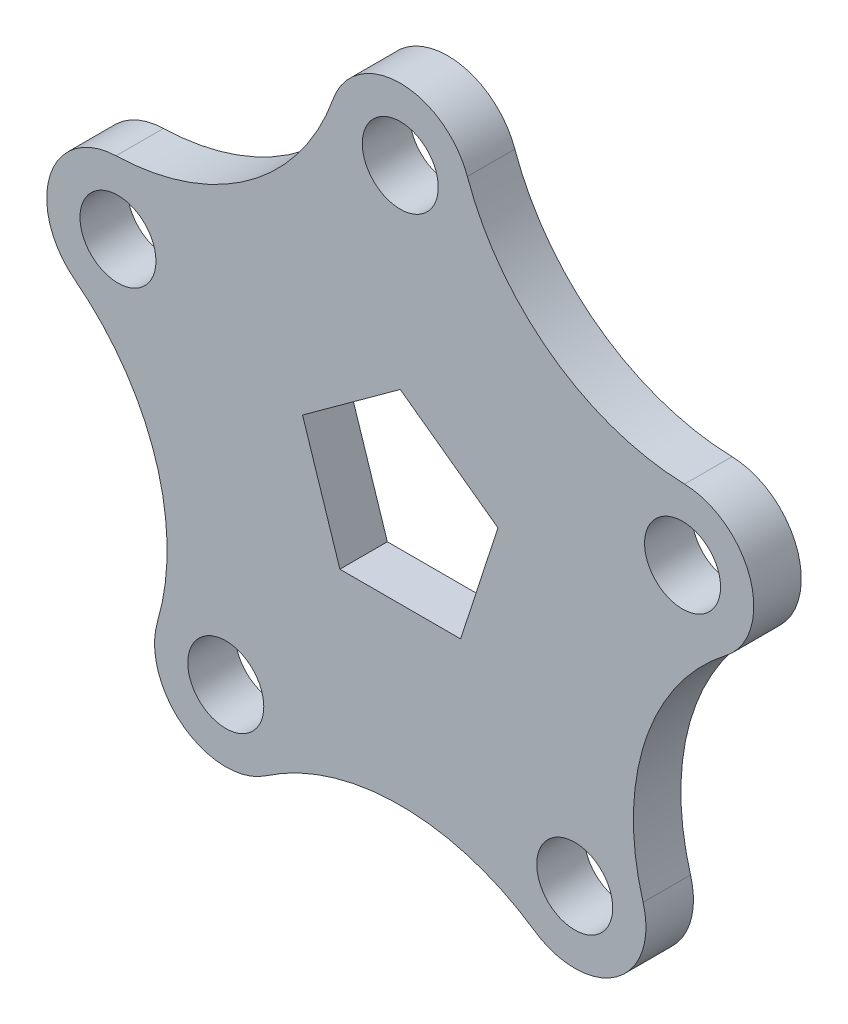
ISO-10303-21;
HEADER;
FILE_DESCRIPTION(('STEP AP214'),'2;1');
FILE_NAME('part.step','',(''),(''),'','','');
FILE_SCHEMA(('AUTOMOTIVE_DESIGN { 1 0 10303 214 1 1 1 1 }'));
ENDSEC;
DATA;
#1=APPLICATION_CONTEXT('core data for automotive mechanical design processes');
#2=APPLICATION_PROTOCOL_DEFINITION('international standard','automotive_design',2000,#1);
#3=PRODUCT_CONTEXT('',#1,'mechanical');
#4=PRODUCT('Part','Part','',(#3));
#5=PRODUCT_RELATED_PRODUCT_CATEGORY('part','',(#4));
#6=PRODUCT_DEFINITION_FORMATION('','',#4);
#7=PRODUCT_DEFINITION_CONTEXT('part definition',#1,'design');
#8=PRODUCT_DEFINITION('design','',#6,#7);
#9=PRODUCT_DEFINITION_SHAPE('','',#8);
#10=(LENGTH_UNIT() NAMED_UNIT(*) SI_UNIT(.MILLI.,.METRE.));
#11=(NAMED_UNIT(*) PLANE_ANGLE_UNIT() SI_UNIT($,.RADIAN.));
#12=(NAMED_UNIT(*) SI_UNIT($,.STERADIAN.) SOLID_ANGLE_UNIT());
#13=UNCERTAINTY_MEASURE_WITH_UNIT(LENGTH_MEASURE(1.E-05),#10,'distance_accuracy_value','');
#14=(GEOMETRIC_REPRESENTATION_CONTEXT(3) GLOBAL_UNCERTAINTY_ASSIGNED_CONTEXT((#13)) GLOBAL_UNIT_ASSIGNED_CONTEXT((#10,
#11,#12)) REPRESENTATION_CONTEXT('',''));
#15=CARTESIAN_POINT('',(0.,0.,0.));
#16=DIRECTION('',(0.,0.,1.));
#17=DIRECTION('',(1.,0.,0.));
#18=AXIS2_PLACEMENT_3D('',#15,#16,#17);
#19=CARTESIAN_POINT('',(-16.6434890351652,-5.40779740156157,10.));
#20=DIRECTION('',(-0.951056516295154,-0.309016994374947,0.));
#21=DIRECTION('',(0.309016994374947,-0.951056516295154,0.));
#22=AXIS2_PLACEMENT_3D('',#19,#20,#21);
#23=PLANE('',#22);
#24=DIRECTION('',(-0.309016994374947,0.951056516295154,0.));
#25=VECTOR('',#24,1.);
#26=CARTESIAN_POINT('',(-16.6434890351652,-5.40779740156157,0.));
#27=LINE('',#26,#25);
#28=CARTESIAN_POINT('',(-12.7144942400938,-17.5,0.));
#29=VERTEX_POINT('',#28);
#30=CARTESIAN_POINT('',(-20.5724838302365,6.68440519687684,0.));
#31=VERTEX_POINT('',#30);
#32=EDGE_CURVE('E250',#29,#31,#27,.T.);
#33=ORIENTED_EDGE('',*,*,#32,.T.);
#34=DIRECTION('',(0.,0.,-1.));
#35=VECTOR('',#34,1.);
#36=CARTESIAN_POINT('',(-20.5724838302365,6.68440519687684,10.));
#37=LINE('',#36,#35);
#38=CARTESIAN_POINT('',(-20.5724838302365,6.68440519687684,10.));
#39=VERTEX_POINT('',#38);
#40=EDGE_CURVE('E11',#39,#31,#37,.T.);
#41=ORIENTED_EDGE('',*,*,#40,.F.);
#42=DIRECTION('',(-0.309016994374947,0.951056516295154,0.));
#43=VECTOR('',#42,1.);
#44=CARTESIAN_POINT('',(-16.6434890351652,-5.40779740156157,10.));
#45=LINE('',#44,#43);
#46=CARTESIAN_POINT('',(-12.7144942400938,-17.5,10.));
#47=VERTEX_POINT('',#46);
#48=EDGE_CURVE('E351',#47,#39,#45,.T.);
#49=ORIENTED_EDGE('',*,*,#48,.F.);
#50=DIRECTION('',(0.,0.,-1.));
#51=VECTOR('',#50,1.);
#52=CARTESIAN_POINT('',(-12.7144942400938,-17.5,10.));
#53=LINE('',#52,#51);
#54=EDGE_CURVE('E264',#47,#29,#53,.T.);
#55=ORIENTED_EDGE('',*,*,#54,.T.);
#56=EDGE_LOOP('',(#33,#41,#49,#55));
#57=FACE_BOUND('',#56,.T.);
#58=ADVANCED_FACE('F45',(#57),#23,.F.);
#59=CARTESIAN_POINT('',(-10.2862419151183,14.1577974015616,10.));
#60=DIRECTION('',(-0.587785252292474,0.809016994374947,0.));
#61=DIRECTION('',(-0.809016994374947,-0.587785252292474,0.));
#62=AXIS2_PLACEMENT_3D('',#59,#60,#61);
#63=PLANE('',#62);
#64=DIRECTION('',(0.809016994374947,0.587785252292474,0.));
#65=VECTOR('',#64,1.);
#66=CARTESIAN_POINT('',(-10.2862419151183,14.1577974015616,0.));
#67=LINE('',#66,#65);
#68=CARTESIAN_POINT('',(0.,21.6311896062463,0.));
#69=VERTEX_POINT('',#68);
#70=EDGE_CURVE('E254',#31,#69,#67,.T.);
#71=ORIENTED_EDGE('',*,*,#70,.T.);
#72=DIRECTION('',(0.,0.,-1.));
#73=VECTOR('',#72,1.);
#74=CARTESIAN_POINT('',(0.,21.6311896062463,10.));
#75=LINE('',#74,#73);
#76=CARTESIAN_POINT('',(0.,21.6311896062463,10.));
#77=VERTEX_POINT('',#76);
#78=EDGE_CURVE('E56',#77,#69,#75,.T.);
#79=ORIENTED_EDGE('',*,*,#78,.F.);
#80=DIRECTION('',(0.809016994374947,0.587785252292474,0.));
#81=VECTOR('',#80,1.);
#82=CARTESIAN_POINT('',(-10.2862419151183,14.1577974015616,10.));
#83=LINE('',#82,#81);
#84=EDGE_CURVE('E169',#39,#77,#83,.T.);
#85=ORIENTED_EDGE('',*,*,#84,.F.);
#86=ORIENTED_EDGE('',*,*,#40,.T.);
#87=EDGE_LOOP('',(#71,#79,#85,#86));
#88=FACE_BOUND('',#87,.T.);
#89=ADVANCED_FACE('F359',(#88),#63,.F.);
#90=CARTESIAN_POINT('',(10.2862419151183,14.1577974015616,10.));
#91=DIRECTION('',(0.587785252292473,0.809016994374947,0.));
#92=DIRECTION('',(-0.809016994374948,0.587785252292473,0.));
#93=AXIS2_PLACEMENT_3D('',#90,#91,#92);
#94=PLANE('',#93);
#95=DIRECTION('',(0.809016994374947,-0.587785252292473,0.));
#96=VECTOR('',#95,1.);
#97=CARTESIAN_POINT('',(10.2862419151183,14.1577974015616,0.));
#98=LINE('',#97,#96);
#99=CARTESIAN_POINT('',(20.5724838302366,6.68440519687684,0.));
#100=VERTEX_POINT('',#99);
#101=EDGE_CURVE('E178',#69,#100,#98,.T.);
#102=ORIENTED_EDGE('',*,*,#101,.T.);
#103=DIRECTION('',(0.,0.,-1.));
#104=VECTOR('',#103,1.);
#105=CARTESIAN_POINT('',(20.5724838302366,6.68440519687684,10.));
#106=LINE('',#105,#104);
#107=CARTESIAN_POINT('',(20.5724838302366,6.68440519687684,10.));
#108=VERTEX_POINT('',#107);
#109=EDGE_CURVE('E175',#108,#100,#106,.T.);
#110=ORIENTED_EDGE('',*,*,#109,.F.);
#111=DIRECTION('',(0.809016994374947,-0.587785252292473,0.));
#112=VECTOR('',#111,1.);
#113=CARTESIAN_POINT('',(10.2862419151183,14.1577974015616,10.));
#114=LINE('',#113,#112);
#115=EDGE_CURVE('E164',#77,#108,#114,.T.);
#116=ORIENTED_EDGE('',*,*,#115,.F.);
#117=ORIENTED_EDGE('',*,*,#78,.T.);
#118=EDGE_LOOP('',(#102,#110,#116,#117));
#119=FACE_BOUND('',#118,.T.);
#120=ADVANCED_FACE('F176',(#119),#94,.F.);
#121=CARTESIAN_POINT('',(16.6434890351652,-5.40779740156158,10.));
#122=DIRECTION('',(0.951056516295154,-0.309016994374948,0.));
#123=DIRECTION('',(0.309016994374948,0.951056516295154,0.));
#124=AXIS2_PLACEMENT_3D('',#121,#122,#123);
#125=PLANE('',#124);
#126=DIRECTION('',(-0.309016994374948,-0.951056516295154,0.));
#127=VECTOR('',#126,1.);
#128=CARTESIAN_POINT('',(16.6434890351652,-5.40779740156158,0.));
#129=LINE('',#128,#127);
#130=CARTESIAN_POINT('',(12.7144942400938,-17.5,0.));
#131=VERTEX_POINT('',#130);
#132=EDGE_CURVE('E115',#100,#131,#129,.T.);
#133=ORIENTED_EDGE('',*,*,#132,.T.);
#134=DIRECTION('',(0.,0.,-1.));
#135=VECTOR('',#134,1.);
#136=CARTESIAN_POINT('',(12.7144942400938,-17.5,10.));
#137=LINE('',#136,#135);
#138=CARTESIAN_POINT('',(12.7144942400938,-17.5,10.));
#139=VERTEX_POINT('',#138);
#140=EDGE_CURVE('E180',#139,#131,#137,.T.);
#141=ORIENTED_EDGE('',*,*,#140,.F.);
#142=DIRECTION('',(-0.309016994374948,-0.951056516295154,0.));
#143=VECTOR('',#142,1.);
#144=CARTESIAN_POINT('',(16.6434890351652,-5.40779740156158,10.));
#145=LINE('',#144,#143);
#146=EDGE_CURVE('E168',#108,#139,#145,.T.);
#147=ORIENTED_EDGE('',*,*,#146,.F.);
#148=ORIENTED_EDGE('',*,*,#109,.T.);
#149=EDGE_LOOP('',(#133,#141,#147,#148));
#150=FACE_BOUND('',#149,.T.);
#151=ADVANCED_FACE('F182',(#150),#125,.F.);
#152=CARTESIAN_POINT('',(-61.2393120472361,84.2886819239083,10.));
#153=DIRECTION('',(0.,0.,-1.));
#154=DIRECTION('',(-1.,0.,0.));
#155=AXIS2_PLACEMENT_3D('',#152,#153,#154);
#156=CYLINDRICAL_SURFACE('',#155,50.);
#157=CARTESIAN_POINT('',(-61.2393120472361,84.2886819239083,0.));
#158=DIRECTION('',(0.,0.,1.));
#159=DIRECTION('',(1.,0.,0.));
#160=AXIS2_PLACEMENT_3D('',#157,#158,#159);
#161=CIRCLE('',#160,50.);
#162=CARTESIAN_POINT('',(-59.8560199097061,34.307820558159,0.));
#163=VERTEX_POINT('',#162);
#164=CARTESIAN_POINT('',(-14.1321489339776,67.5281573670558,0.));
#165=VERTEX_POINT('',#164);
#166=EDGE_CURVE('E210',#163,#165,#161,.T.);
#167=ORIENTED_EDGE('',*,*,#166,.F.);
#168=DIRECTION('',(0.,0.,-1.));
#169=VECTOR('',#168,1.);
#170=CARTESIAN_POINT('',(-59.8560199097061,34.307820558159,10.));
#171=LINE('',#170,#169);
#172=CARTESIAN_POINT('',(-59.8560199097061,34.307820558159,10.));
#173=VERTEX_POINT('',#172);
#174=EDGE_CURVE('E49',#173,#163,#171,.T.);
#175=ORIENTED_EDGE('',*,*,#174,.F.);
#176=CARTESIAN_POINT('',(-61.2393120472361,84.2886819239083,10.));
#177=DIRECTION('',(0.,0.,1.));
#178=DIRECTION('',(1.,0.,0.));
#179=AXIS2_PLACEMENT_3D('',#176,#177,#178);
#180=CIRCLE('',#179,50.);
#181=CARTESIAN_POINT('',(-14.1321489339776,67.5281573670558,10.));
#182=VERTEX_POINT('',#181);
#183=EDGE_CURVE('E462',#173,#182,#180,.T.);
#184=ORIENTED_EDGE('',*,*,#183,.T.);
#185=DIRECTION('',(0.,0.,-1.));
#186=VECTOR('',#185,1.);
#187=CARTESIAN_POINT('',(-14.1321489339776,67.5281573670558,10.));
#188=LINE('',#187,#186);
#189=EDGE_CURVE('E186',#182,#165,#188,.T.);
#190=ORIENTED_EDGE('',*,*,#189,.T.);
#191=EDGE_LOOP('',(#167,#175,#184,#190));
#192=FACE_BOUND('',#191,.T.);
#193=ADVANCED_FACE('F305',(#192),#156,.F.);
#194=CARTESIAN_POINT('',(-59.4410322684471,19.3135621484342,10.));
#195=DIRECTION('',(0.,0.,-1.));
#196=DIRECTION('',(-1.,0.,0.));
#197=AXIS2_PLACEMENT_3D('',#194,#195,#196);
#198=CYLINDRICAL_SURFACE('',#197,15.);
#199=CARTESIAN_POINT('',(-59.4410322684471,19.3135621484342,0.));
#200=DIRECTION('',(0.,0.,1.));
#201=DIRECTION('',(1.,0.,0.));
#202=AXIS2_PLACEMENT_3D('',#199,#200,#201);
#203=CIRCLE('',#202,15.);
#204=CARTESIAN_POINT('',(-68.5901682849798,7.42687589233304,0.));
#205=VERTEX_POINT('',#204);
#206=EDGE_CURVE('E214',#205,#163,#203,.F.);
#207=ORIENTED_EDGE('',*,*,#206,.F.);
#208=DIRECTION('',(0.,0.,-1.));
#209=VECTOR('',#208,1.);
#210=CARTESIAN_POINT('',(-68.5901682849798,7.42687589233304,10.));
#211=LINE('',#210,#209);
#212=CARTESIAN_POINT('',(-68.5901682849798,7.42687589233304,10.));
#213=VERTEX_POINT('',#212);
#214=EDGE_CURVE('E293',#213,#205,#211,.T.);
#215=ORIENTED_EDGE('',*,*,#214,.F.);
#216=CARTESIAN_POINT('',(-59.4410322684471,19.3135621484342,10.));
#217=DIRECTION('',(0.,0.,1.));
#218=DIRECTION('',(1.,0.,0.));
#219=AXIS2_PLACEMENT_3D('',#216,#217,#218);
#220=CIRCLE('',#219,15.);
#221=EDGE_CURVE('E304',#213,#173,#220,.F.);
#222=ORIENTED_EDGE('',*,*,#221,.T.);
#223=ORIENTED_EDGE('',*,*,#174,.T.);
#224=EDGE_LOOP('',(#207,#215,#222,#223));
#225=FACE_BOUND('',#224,.T.);
#226=ADVANCED_FACE('F302',(#225),#198,.T.);
#227=CARTESIAN_POINT('',(-99.0872883400889,-32.1954116280041,10.));
#228=DIRECTION('',(0.,0.,-1.));
#229=DIRECTION('',(-1.,0.,0.));
#230=AXIS2_PLACEMENT_3D('',#227,#228,#229);
#231=CYLINDRICAL_SURFACE('',#230,50.);
#232=CARTESIAN_POINT('',(-99.0872883400889,-32.1954116280041,0.));
#233=DIRECTION('',(0.,0.,1.));
#234=DIRECTION('',(1.,0.,0.));
#235=AXIS2_PLACEMENT_3D('',#232,#233,#234);
#236=CIRCLE('',#235,50.);
#237=CARTESIAN_POINT('',(-51.1252036694664,-46.3247581821811,0.));
#238=VERTEX_POINT('',#237);
#239=EDGE_CURVE('E218',#238,#205,#236,.T.);
#240=ORIENTED_EDGE('',*,*,#239,.F.);
#241=DIRECTION('',(0.,0.,-1.));
#242=VECTOR('',#241,1.);
#243=CARTESIAN_POINT('',(-51.1252036694664,-46.3247581821811,10.));
#244=LINE('',#243,#242);
#245=CARTESIAN_POINT('',(-51.1252036694664,-46.3247581821811,10.));
#246=VERTEX_POINT('',#245);
#247=EDGE_CURVE('E291',#246,#238,#244,.T.);
#248=ORIENTED_EDGE('',*,*,#247,.F.);
#249=CARTESIAN_POINT('',(-99.0872883400889,-32.1954116280041,10.));
#250=DIRECTION('',(0.,0.,1.));
#251=DIRECTION('',(1.,0.,0.));
#252=AXIS2_PLACEMENT_3D('',#249,#250,#251);
#253=CIRCLE('',#252,50.);
#254=EDGE_CURVE('E313',#246,#213,#253,.T.);
#255=ORIENTED_EDGE('',*,*,#254,.T.);
#256=ORIENTED_EDGE('',*,*,#214,.T.);
#257=EDGE_LOOP('',(#240,#248,#255,#256));
#258=FACE_BOUND('',#257,.T.);
#259=ADVANCED_FACE('F311',(#258),#231,.F.);
#260=CARTESIAN_POINT('',(-36.7365782682796,-50.5635621484342,10.));
#261=DIRECTION('',(0.,0.,-1.));
#262=DIRECTION('',(-1.,0.,0.));
#263=AXIS2_PLACEMENT_3D('',#260,#261,#262);
#264=CYLINDRICAL_SURFACE('',#263,15.);
#265=CARTESIAN_POINT('',(-36.7365782682796,-50.5635621484342,0.));
#266=DIRECTION('',(0.,0.,1.));
#267=DIRECTION('',(1.,0.,0.));
#268=AXIS2_PLACEMENT_3D('',#265,#266,#267);
#269=CIRCLE('',#268,15.);
#270=CARTESIAN_POINT('',(-28.2589063602151,-62.9380956353668,0.));
#271=VERTEX_POINT('',#270);
#272=EDGE_CURVE('E222',#271,#238,#269,.F.);
#273=ORIENTED_EDGE('',*,*,#272,.F.);
#274=DIRECTION('',(0.,0.,-1.));
#275=VECTOR('',#274,1.);
#276=CARTESIAN_POINT('',(-28.2589063602151,-62.9380956353668,10.));
#277=LINE('',#276,#275);
#278=CARTESIAN_POINT('',(-28.2589063602151,-62.9380956353668,10.));
#279=VERTEX_POINT('',#278);
#280=EDGE_CURVE('E288',#279,#271,#277,.T.);
#281=ORIENTED_EDGE('',*,*,#280,.F.);
#282=CARTESIAN_POINT('',(-36.7365782682796,-50.5635621484342,10.));
#283=DIRECTION('',(0.,0.,1.));
#284=DIRECTION('',(1.,0.,0.));
#285=AXIS2_PLACEMENT_3D('',#282,#283,#284);
#286=CIRCLE('',#285,15.);
#287=EDGE_CURVE('E319',#279,#246,#286,.F.);
#288=ORIENTED_EDGE('',*,*,#287,.T.);
#289=ORIENTED_EDGE('',*,*,#247,.T.);
#290=EDGE_LOOP('',(#273,#281,#288,#289));
#291=FACE_BOUND('',#290,.T.);
#292=ADVANCED_FACE('F323',(#291),#264,.T.);
#293=CARTESIAN_POINT('',(0.,-104.186540591808,10.));
#294=DIRECTION('',(0.,0.,-1.));
#295=DIRECTION('',(-1.,0.,0.));
#296=AXIS2_PLACEMENT_3D('',#293,#294,#295);
#297=CYLINDRICAL_SURFACE('',#296,50.);
#298=CARTESIAN_POINT('',(0.,-104.186540591808,0.));
#299=DIRECTION('',(0.,0.,1.));
#300=DIRECTION('',(1.,0.,0.));
#301=AXIS2_PLACEMENT_3D('',#298,#299,#300);
#302=CIRCLE('',#301,50.);
#303=CARTESIAN_POINT('',(28.2589063602151,-62.9380956353667,0.));
#304=VERTEX_POINT('',#303);
#305=EDGE_CURVE('E226',#304,#271,#302,.T.);
#306=ORIENTED_EDGE('',*,*,#305,.F.);
#307=DIRECTION('',(0.,0.,-1.));
#308=VECTOR('',#307,1.);
#309=CARTESIAN_POINT('',(28.2589063602151,-62.9380956353667,10.));
#310=LINE('',#309,#308);
#311=CARTESIAN_POINT('',(28.2589063602151,-62.9380956353667,10.));
#312=VERTEX_POINT('',#311);
#313=EDGE_CURVE('E285',#312,#304,#310,.T.);
#314=ORIENTED_EDGE('',*,*,#313,.F.);
#315=CARTESIAN_POINT('',(0.,-104.186540591808,10.));
#316=DIRECTION('',(0.,0.,1.));
#317=DIRECTION('',(1.,0.,0.));
#318=AXIS2_PLACEMENT_3D('',#315,#316,#317);
#319=CIRCLE('',#318,50.);
#320=EDGE_CURVE('E325',#312,#279,#319,.T.);
#321=ORIENTED_EDGE('',*,*,#320,.T.);
#322=ORIENTED_EDGE('',*,*,#280,.T.);
#323=EDGE_LOOP('',(#306,#314,#321,#322));
#324=FACE_BOUND('',#323,.T.);
#325=ADVANCED_FACE('F399',(#324),#297,.F.);
#326=CARTESIAN_POINT('',(36.7365782682796,-50.5635621484342,10.));
#327=DIRECTION('',(0.,0.,-1.));
#328=DIRECTION('',(-1.,0.,0.));
#329=AXIS2_PLACEMENT_3D('',#326,#327,#328);
#330=CYLINDRICAL_SURFACE('',#329,15.);
#331=CARTESIAN_POINT('',(36.7365782682796,-50.5635621484342,0.));
#332=DIRECTION('',(0.,0.,1.));
#333=DIRECTION('',(1.,0.,0.));
#334=AXIS2_PLACEMENT_3D('',#331,#332,#333);
#335=CIRCLE('',#334,15.);
#336=CARTESIAN_POINT('',(51.1252036694664,-46.3247581821811,0.));
#337=VERTEX_POINT('',#336);
#338=EDGE_CURVE('E230',#337,#304,#335,.F.);
#339=ORIENTED_EDGE('',*,*,#338,.F.);
#340=DIRECTION('',(0.,0.,-1.));
#341=VECTOR('',#340,1.);
#342=CARTESIAN_POINT('',(51.1252036694664,-46.3247581821811,10.));
#343=LINE('',#342,#341);
#344=CARTESIAN_POINT('',(51.1252036694664,-46.3247581821811,10.));
#345=VERTEX_POINT('',#344);
#346=EDGE_CURVE('E282',#345,#337,#343,.T.);
#347=ORIENTED_EDGE('',*,*,#346,.F.);
#348=CARTESIAN_POINT('',(36.7365782682796,-50.5635621484342,10.));
#349=DIRECTION('',(0.,0.,1.));
#350=DIRECTION('',(1.,0.,0.));
#351=AXIS2_PLACEMENT_3D('',#348,#349,#350);
#352=CIRCLE('',#351,15.);
#353=EDGE_CURVE('E328',#345,#312,#352,.F.);
#354=ORIENTED_EDGE('',*,*,#353,.T.);
#355=ORIENTED_EDGE('',*,*,#313,.T.);
#356=EDGE_LOOP('',(#339,#347,#354,#355));
#357=FACE_BOUND('',#356,.T.);
#358=ADVANCED_FACE('F395',(#357),#330,.T.);
#359=CARTESIAN_POINT('',(99.0872883400889,-32.1954116280041,10.));
#360=DIRECTION('',(0.,0.,-1.));
#361=DIRECTION('',(-1.,0.,0.));
#362=AXIS2_PLACEMENT_3D('',#359,#360,#361);
#363=CYLINDRICAL_SURFACE('',#362,50.);
#364=CARTESIAN_POINT('',(99.0872883400889,-32.1954116280041,0.));
#365=DIRECTION('',(0.,0.,1.));
#366=DIRECTION('',(1.,0.,0.));
#367=AXIS2_PLACEMENT_3D('',#364,#365,#366);
#368=CIRCLE('',#367,50.);
#369=CARTESIAN_POINT('',(68.5901682849798,7.42687589233306,0.));
#370=VERTEX_POINT('',#369);
#371=EDGE_CURVE('E234',#370,#337,#368,.T.);
#372=ORIENTED_EDGE('',*,*,#371,.F.);
#373=DIRECTION('',(0.,0.,-1.));
#374=VECTOR('',#373,1.);
#375=CARTESIAN_POINT('',(68.5901682849798,7.42687589233306,10.));
#376=LINE('',#375,#374);
#377=CARTESIAN_POINT('',(68.5901682849798,7.42687589233306,10.));
#378=VERTEX_POINT('',#377);
#379=EDGE_CURVE('E279',#378,#370,#376,.T.);
#380=ORIENTED_EDGE('',*,*,#379,.F.);
#381=CARTESIAN_POINT('',(99.0872883400889,-32.1954116280041,10.));
#382=DIRECTION('',(0.,0.,1.));
#383=DIRECTION('',(1.,0.,0.));
#384=AXIS2_PLACEMENT_3D('',#381,#382,#383);
#385=CIRCLE('',#384,50.);
#386=EDGE_CURVE('E335',#378,#345,#385,.T.);
#387=ORIENTED_EDGE('',*,*,#386,.T.);
#388=ORIENTED_EDGE('',*,*,#346,.T.);
#389=EDGE_LOOP('',(#372,#380,#387,#388));
#390=FACE_BOUND('',#389,.T.);
#391=ADVANCED_FACE('F391',(#390),#363,.F.);
#392=CARTESIAN_POINT('',(59.4410322684471,19.3135621484342,10.));
#393=DIRECTION('',(0.,0.,-1.));
#394=DIRECTION('',(-1.,0.,0.));
#395=AXIS2_PLACEMENT_3D('',#392,#393,#394);
#396=CYLINDRICAL_SURFACE('',#395,15.);
#397=CARTESIAN_POINT('',(59.4410322684471,19.3135621484342,0.));
#398=DIRECTION('',(0.,0.,1.));
#399=DIRECTION('',(1.,0.,0.));
#400=AXIS2_PLACEMENT_3D('',#397,#398,#399);
#401=CIRCLE('',#400,15.);
#402=CARTESIAN_POINT('',(59.8560199097061,34.307820558159,0.));
#403=VERTEX_POINT('',#402);
#404=EDGE_CURVE('E238',#403,#370,#401,.F.);
#405=ORIENTED_EDGE('',*,*,#404,.F.);
#406=DIRECTION('',(0.,0.,-1.));
#407=VECTOR('',#406,1.);
#408=CARTESIAN_POINT('',(59.8560199097061,34.307820558159,10.));
#409=LINE('',#408,#407);
#410=CARTESIAN_POINT('',(59.8560199097061,34.307820558159,10.));
#411=VERTEX_POINT('',#410);
#412=EDGE_CURVE('E276',#411,#403,#409,.T.);
#413=ORIENTED_EDGE('',*,*,#412,.F.);
#414=CARTESIAN_POINT('',(59.4410322684471,19.3135621484342,10.));
#415=DIRECTION('',(0.,0.,1.));
#416=DIRECTION('',(1.,0.,0.));
#417=AXIS2_PLACEMENT_3D('',#414,#415,#416);
#418=CIRCLE('',#417,15.);
#419=EDGE_CURVE('E339',#411,#378,#418,.F.);
#420=ORIENTED_EDGE('',*,*,#419,.T.);
#421=ORIENTED_EDGE('',*,*,#379,.T.);
#422=EDGE_LOOP('',(#405,#413,#420,#421));
#423=FACE_BOUND('',#422,.T.);
#424=ADVANCED_FACE('F387',(#423),#396,.T.);
#425=CARTESIAN_POINT('',(61.2393120472361,84.2886819239083,10.));
#426=DIRECTION('',(0.,0.,-1.));
#427=DIRECTION('',(-1.,0.,0.));
#428=AXIS2_PLACEMENT_3D('',#425,#426,#427);
#429=CYLINDRICAL_SURFACE('',#428,50.);
#430=CARTESIAN_POINT('',(61.2393120472361,84.2886819239083,0.));
#431=DIRECTION('',(0.,0.,1.));
#432=DIRECTION('',(1.,0.,0.));
#433=AXIS2_PLACEMENT_3D('',#430,#431,#432);
#434=CIRCLE('',#433,50.);
#435=CARTESIAN_POINT('',(14.1321489339776,67.5281573670558,0.));
#436=VERTEX_POINT('',#435);
#437=EDGE_CURVE('E242',#436,#403,#434,.T.);
#438=ORIENTED_EDGE('',*,*,#437,.F.);
#439=DIRECTION('',(0.,0.,-1.));
#440=VECTOR('',#439,1.);
#441=CARTESIAN_POINT('',(14.1321489339776,67.5281573670558,10.));
#442=LINE('',#441,#440);
#443=CARTESIAN_POINT('',(14.1321489339776,67.5281573670558,10.));
#444=VERTEX_POINT('',#443);
#445=EDGE_CURVE('E273',#444,#436,#442,.T.);
#446=ORIENTED_EDGE('',*,*,#445,.F.);
#447=CARTESIAN_POINT('',(61.2393120472361,84.2886819239083,10.));
#448=DIRECTION('',(0.,0.,1.));
#449=DIRECTION('',(1.,0.,0.));
#450=AXIS2_PLACEMENT_3D('',#447,#448,#449);
#451=CIRCLE('',#450,50.);
#452=EDGE_CURVE('E343',#444,#411,#451,.T.);
#453=ORIENTED_EDGE('',*,*,#452,.T.);
#454=ORIENTED_EDGE('',*,*,#412,.T.);
#455=EDGE_LOOP('',(#438,#446,#453,#454));
#456=FACE_BOUND('',#455,.T.);
#457=ADVANCED_FACE('F383',(#456),#429,.F.);
#458=CARTESIAN_POINT('',(0.,62.5,10.));
#459=DIRECTION('',(0.,0.,-1.));
#460=DIRECTION('',(-1.,0.,0.));
#461=AXIS2_PLACEMENT_3D('',#458,#459,#460);
#462=CYLINDRICAL_SURFACE('',#461,15.);
#463=CARTESIAN_POINT('',(0.,62.5,0.));
#464=DIRECTION('',(0.,0.,1.));
#465=DIRECTION('',(1.,0.,0.));
#466=AXIS2_PLACEMENT_3D('',#463,#464,#465);
#467=CIRCLE('',#466,15.);
#468=EDGE_CURVE('E246',#165,#436,#467,.F.);
#469=ORIENTED_EDGE('',*,*,#468,.F.);
#470=ORIENTED_EDGE('',*,*,#189,.F.);
#471=CARTESIAN_POINT('',(0.,62.5,10.));
#472=DIRECTION('',(0.,0.,1.));
#473=DIRECTION('',(1.,0.,0.));
#474=AXIS2_PLACEMENT_3D('',#471,#472,#473);
#475=CIRCLE('',#474,15.);
#476=EDGE_CURVE('E347',#182,#444,#475,.F.);
#477=ORIENTED_EDGE('',*,*,#476,.T.);
#478=ORIENTED_EDGE('',*,*,#445,.T.);
#479=EDGE_LOOP('',(#469,#470,#477,#478));
#480=FACE_BOUND('',#479,.T.);
#481=ADVANCED_FACE('F379',(#480),#462,.T.);
#482=CARTESIAN_POINT('',(0.,62.5,10.));
#483=DIRECTION('',(0.,0.,-1.));
#484=DIRECTION('',(-1.,0.,0.));
#485=AXIS2_PLACEMENT_3D('',#482,#483,#484);
#486=CYLINDRICAL_SURFACE('',#485,8.00000000000001);
#487=CARTESIAN_POINT('',(0.,62.5,10.));
#488=DIRECTION('',(0.,0.,1.));
#489=DIRECTION('',(1.,0.,0.));
#490=AXIS2_PLACEMENT_3D('',#487,#488,#489);
#491=CIRCLE('',#490,8.00000000000001);
#492=CARTESIAN_POINT('',(8.00000000000001,62.5,10.));
#493=VERTEX_POINT('',#492);
#494=EDGE_CURVE('E458',#493,#493,#491,.T.);
#495=ORIENTED_EDGE('',*,*,#494,.T.);
#496=EDGE_LOOP('',(#495));
#497=FACE_BOUND('',#496,.T.);
#498=CARTESIAN_POINT('',(0.,62.5,0.));
#499=DIRECTION('',(0.,0.,1.));
#500=DIRECTION('',(1.,0.,0.));
#501=AXIS2_PLACEMENT_3D('',#498,#499,#500);
#502=CIRCLE('',#501,8.00000000000001);
#503=CARTESIAN_POINT('',(8.00000000000001,62.5,0.));
#504=VERTEX_POINT('',#503);
#505=EDGE_CURVE('E206',#504,#504,#502,.T.);
#506=ORIENTED_EDGE('',*,*,#505,.F.);
#507=EDGE_LOOP('',(#506));
#508=FACE_BOUND('',#507,.T.);
#509=ADVANCED_FACE('F382',(#497,#508),#486,.F.);
#510=CARTESIAN_POINT('',(59.4410322684471,19.3135621484342,10.));
#511=DIRECTION('',(0.,0.,-1.));
#512=DIRECTION('',(-1.,0.,0.));
#513=AXIS2_PLACEMENT_3D('',#510,#511,#512);
#514=CYLINDRICAL_SURFACE('',#513,8.00000000000003);
#515=CARTESIAN_POINT('',(59.4410322684471,19.3135621484342,10.));
#516=DIRECTION('',(0.,0.,1.));
#517=DIRECTION('',(1.,0.,0.));
#518=AXIS2_PLACEMENT_3D('',#515,#516,#517);
#519=CIRCLE('',#518,8.00000000000003);
#520=CARTESIAN_POINT('',(67.4410322684471,19.3135621484342,10.));
#521=VERTEX_POINT('',#520);
#522=EDGE_CURVE('E450',#521,#521,#519,.T.);
#523=ORIENTED_EDGE('',*,*,#522,.T.);
#524=EDGE_LOOP('',(#523));
#525=FACE_BOUND('',#524,.T.);
#526=CARTESIAN_POINT('',(59.4410322684471,19.3135621484342,0.));
#527=DIRECTION('',(0.,0.,1.));
#528=DIRECTION('',(1.,0.,0.));
#529=AXIS2_PLACEMENT_3D('',#526,#527,#528);
#530=CIRCLE('',#529,8.00000000000003);
#531=CARTESIAN_POINT('',(67.4410322684471,19.3135621484342,0.));
#532=VERTEX_POINT('',#531);
#533=EDGE_CURVE('E202',#532,#532,#530,.T.);
#534=ORIENTED_EDGE('',*,*,#533,.F.);
#535=EDGE_LOOP('',(#534));
#536=FACE_BOUND('',#535,.T.);
#537=ADVANCED_FACE('F414',(#525,#536),#514,.F.);
#538=CARTESIAN_POINT('',(36.7365782682796,-50.5635621484342,10.));
#539=DIRECTION('',(0.,0.,-1.));
#540=DIRECTION('',(-1.,0.,0.));
#541=AXIS2_PLACEMENT_3D('',#538,#539,#540);
#542=CYLINDRICAL_SURFACE('',#541,7.99999999999999);
#543=CARTESIAN_POINT('',(36.7365782682796,-50.5635621484342,10.));
#544=DIRECTION('',(0.,0.,1.));
#545=DIRECTION('',(1.,0.,0.));
#546=AXIS2_PLACEMENT_3D('',#543,#544,#545);
#547=CIRCLE('',#546,7.99999999999999);
#548=CARTESIAN_POINT('',(44.7365782682796,-50.5635621484342,10.));
#549=VERTEX_POINT('',#548);
#550=EDGE_CURVE('E445',#549,#549,#547,.T.);
#551=ORIENTED_EDGE('',*,*,#550,.T.);
#552=EDGE_LOOP('',(#551));
#553=FACE_BOUND('',#552,.T.);
#554=CARTESIAN_POINT('',(36.7365782682796,-50.5635621484342,0.));
#555=DIRECTION('',(0.,0.,1.));
#556=DIRECTION('',(1.,0.,0.));
#557=AXIS2_PLACEMENT_3D('',#554,#555,#556);
#558=CIRCLE('',#557,7.99999999999999);
#559=CARTESIAN_POINT('',(44.7365782682796,-50.5635621484342,0.));
#560=VERTEX_POINT('',#559);
#561=EDGE_CURVE('E198',#560,#560,#558,.T.);
#562=ORIENTED_EDGE('',*,*,#561,.F.);
#563=EDGE_LOOP('',(#562));
#564=FACE_BOUND('',#563,.T.);
#565=ADVANCED_FACE('F418',(#553,#564),#542,.F.);
#566=CARTESIAN_POINT('',(-36.7365782682796,-50.5635621484342,10.));
#567=DIRECTION('',(0.,0.,-1.));
#568=DIRECTION('',(-1.,0.,0.));
#569=AXIS2_PLACEMENT_3D('',#566,#567,#568);
#570=CYLINDRICAL_SURFACE('',#569,8.);
#571=CARTESIAN_POINT('',(-36.7365782682796,-50.5635621484342,10.));
#572=DIRECTION('',(0.,0.,1.));
#573=DIRECTION('',(1.,0.,0.));
#574=AXIS2_PLACEMENT_3D('',#571,#572,#573);
#575=CIRCLE('',#574,8.);
#576=CARTESIAN_POINT('',(-28.7365782682796,-50.5635621484342,10.));
#577=VERTEX_POINT('',#576);
#578=EDGE_CURVE('E432',#577,#577,#575,.T.);
#579=ORIENTED_EDGE('',*,*,#578,.T.);
#580=EDGE_LOOP('',(#579));
#581=FACE_BOUND('',#580,.T.);
#582=CARTESIAN_POINT('',(-36.7365782682796,-50.5635621484342,0.));
#583=DIRECTION('',(0.,0.,1.));
#584=DIRECTION('',(1.,0.,0.));
#585=AXIS2_PLACEMENT_3D('',#582,#583,#584);
#586=CIRCLE('',#585,8.);
#587=CARTESIAN_POINT('',(-28.7365782682796,-50.5635621484342,0.));
#588=VERTEX_POINT('',#587);
#589=EDGE_CURVE('E194',#588,#588,#586,.T.);
#590=ORIENTED_EDGE('',*,*,#589,.F.);
#591=EDGE_LOOP('',(#590));
#592=FACE_BOUND('',#591,.T.);
#593=ADVANCED_FACE('F421',(#581,#592),#570,.F.);
#594=CARTESIAN_POINT('',(-59.4410322684471,19.3135621484342,10.));
#595=DIRECTION('',(0.,0.,-1.));
#596=DIRECTION('',(-1.,0.,0.));
#597=AXIS2_PLACEMENT_3D('',#594,#595,#596);
#598=CYLINDRICAL_SURFACE('',#597,8.);
#599=CARTESIAN_POINT('',(-59.4410322684471,19.3135621484342,10.));
#600=DIRECTION('',(0.,0.,1.));
#601=DIRECTION('',(1.,0.,0.));
#602=AXIS2_PLACEMENT_3D('',#599,#600,#601);
#603=CIRCLE('',#602,8.);
#604=CARTESIAN_POINT('',(-51.4410322684471,19.3135621484342,10.));
#605=VERTEX_POINT('',#604);
#606=EDGE_CURVE('E263',#605,#605,#603,.T.);
#607=ORIENTED_EDGE('',*,*,#606,.T.);
#608=EDGE_LOOP('',(#607));
#609=FACE_BOUND('',#608,.T.);
#610=CARTESIAN_POINT('',(-59.4410322684471,19.3135621484342,0.));
#611=DIRECTION('',(0.,0.,1.));
#612=DIRECTION('',(1.,0.,0.));
#613=AXIS2_PLACEMENT_3D('',#610,#611,#612);
#614=CIRCLE('',#613,8.);
#615=CARTESIAN_POINT('',(-51.4410322684471,19.3135621484342,0.));
#616=VERTEX_POINT('',#615);
#617=EDGE_CURVE('E190',#616,#616,#614,.T.);
#618=ORIENTED_EDGE('',*,*,#617,.F.);
#619=EDGE_LOOP('',(#618));
#620=FACE_BOUND('',#619,.T.);
#621=ADVANCED_FACE('F47',(#609,#620),#598,.F.);
#622=CARTESIAN_POINT('',(0.,-17.5,10.));
#623=DIRECTION('',(0.,-1.,0.));
#624=DIRECTION('',(0.,0.,-1.));
#625=AXIS2_PLACEMENT_3D('',#622,#623,#624);
#626=PLANE('',#625);
#627=DIRECTION('',(-1.,0.,0.));
#628=VECTOR('',#627,1.);
#629=CARTESIAN_POINT('',(0.,-17.5,0.));
#630=LINE('',#629,#628);
#631=EDGE_CURVE('E121',#131,#29,#630,.T.);
#632=ORIENTED_EDGE('',*,*,#631,.T.);
#633=ORIENTED_EDGE('',*,*,#54,.F.);
#634=DIRECTION('',(-1.,0.,0.));
#635=VECTOR('',#634,1.);
#636=CARTESIAN_POINT('',(0.,-17.5,10.));
#637=LINE('',#636,#635);
#638=EDGE_CURVE('E65',#139,#47,#637,.T.);
#639=ORIENTED_EDGE('',*,*,#638,.F.);
#640=ORIENTED_EDGE('',*,*,#140,.T.);
#641=EDGE_LOOP('',(#632,#633,#639,#640));
#642=FACE_BOUND('',#641,.T.);
#643=ADVANCED_FACE('F366',(#642),#626,.F.);
#644=CARTESIAN_POINT('',(0.,0.,10.));
#645=DIRECTION('',(0.,0.,1.));
#646=DIRECTION('',(1.,0.,0.));
#647=AXIS2_PLACEMENT_3D('',#644,#645,#646);
#648=PLANE('',#647);
#649=ORIENTED_EDGE('',*,*,#606,.F.);
#650=EDGE_LOOP('',(#649));
#651=FACE_BOUND('',#650,.T.);
#652=ORIENTED_EDGE('',*,*,#578,.F.);
#653=EDGE_LOOP('',(#652));
#654=FACE_BOUND('',#653,.T.);
#655=ORIENTED_EDGE('',*,*,#550,.F.);
#656=EDGE_LOOP('',(#655));
#657=FACE_BOUND('',#656,.T.);
#658=ORIENTED_EDGE('',*,*,#522,.F.);
#659=EDGE_LOOP('',(#658));
#660=FACE_BOUND('',#659,.T.);
#661=ORIENTED_EDGE('',*,*,#494,.F.);
#662=EDGE_LOOP('',(#661));
#663=FACE_BOUND('',#662,.T.);
#664=ORIENTED_EDGE('',*,*,#183,.F.);
#665=ORIENTED_EDGE('',*,*,#221,.F.);
#666=ORIENTED_EDGE('',*,*,#254,.F.);
#667=ORIENTED_EDGE('',*,*,#287,.F.);
#668=ORIENTED_EDGE('',*,*,#320,.F.);
#669=ORIENTED_EDGE('',*,*,#353,.F.);
#670=ORIENTED_EDGE('',*,*,#386,.F.);
#671=ORIENTED_EDGE('',*,*,#419,.F.);
#672=ORIENTED_EDGE('',*,*,#452,.F.);
#673=ORIENTED_EDGE('',*,*,#476,.F.);
#674=EDGE_LOOP('',(#664,#665,#666,#667,#668,#669,#670,#671,#672,#673));
#675=FACE_BOUND('',#674,.T.);
#676=ORIENTED_EDGE('',*,*,#48,.T.);
#677=ORIENTED_EDGE('',*,*,#84,.T.);
#678=ORIENTED_EDGE('',*,*,#115,.T.);
#679=ORIENTED_EDGE('',*,*,#146,.T.);
#680=ORIENTED_EDGE('',*,*,#638,.T.);
#681=EDGE_LOOP('',(#676,#677,#678,#679,#680));
#682=FACE_BOUND('',#681,.T.);
#683=ADVANCED_FACE('F166',(#651,#654,#657,#660,#663,#675,#682),#648,.T.);
#684=CARTESIAN_POINT('',(0.,0.,0.));
#685=DIRECTION('',(0.,0.,1.));
#686=DIRECTION('',(1.,0.,0.));
#687=AXIS2_PLACEMENT_3D('',#684,#685,#686);
#688=PLANE('',#687);
#689=ORIENTED_EDGE('',*,*,#617,.T.);
#690=EDGE_LOOP('',(#689));
#691=FACE_BOUND('',#690,.T.);
#692=ORIENTED_EDGE('',*,*,#589,.T.);
#693=EDGE_LOOP('',(#692));
#694=FACE_BOUND('',#693,.T.);
#695=ORIENTED_EDGE('',*,*,#561,.T.);
#696=EDGE_LOOP('',(#695));
#697=FACE_BOUND('',#696,.T.);
#698=ORIENTED_EDGE('',*,*,#533,.T.);
#699=EDGE_LOOP('',(#698));
#700=FACE_BOUND('',#699,.T.);
#701=ORIENTED_EDGE('',*,*,#505,.T.);
#702=EDGE_LOOP('',(#701));
#703=FACE_BOUND('',#702,.T.);
#704=ORIENTED_EDGE('',*,*,#166,.T.);
#705=ORIENTED_EDGE('',*,*,#468,.T.);
#706=ORIENTED_EDGE('',*,*,#437,.T.);
#707=ORIENTED_EDGE('',*,*,#404,.T.);
#708=ORIENTED_EDGE('',*,*,#371,.T.);
#709=ORIENTED_EDGE('',*,*,#338,.T.);
#710=ORIENTED_EDGE('',*,*,#305,.T.);
#711=ORIENTED_EDGE('',*,*,#272,.T.);
#712=ORIENTED_EDGE('',*,*,#239,.T.);
#713=ORIENTED_EDGE('',*,*,#206,.T.);
#714=EDGE_LOOP('',(#704,#705,#706,#707,#708,#709,#710,#711,#712,#713));
#715=FACE_BOUND('',#714,.T.);
#716=ORIENTED_EDGE('',*,*,#32,.F.);
#717=ORIENTED_EDGE('',*,*,#631,.F.);
#718=ORIENTED_EDGE('',*,*,#132,.F.);
#719=ORIENTED_EDGE('',*,*,#101,.F.);
#720=ORIENTED_EDGE('',*,*,#70,.F.);
#721=EDGE_LOOP('',(#716,#717,#718,#719,#720));
#722=FACE_BOUND('',#721,.T.);
#723=ADVANCED_FACE('F308',(#691,#694,#697,#700,#703,#715,#722),#688,.F.);
#724=CLOSED_SHELL('',(#58,#89,#120,#151,#193,#226,#259,#292,#325,#358,#391,#424,#457,#481,#509,
#537,#565,#593,#621,#643,#683,#723));
#725=MANIFOLD_SOLID_BREP('B2',#724);
#726=ADVANCED_BREP_SHAPE_REPRESENTATION('',(#18,#725),#14);
#727=SHAPE_DEFINITION_REPRESENTATION(#9,#726);
ENDSEC;
END-ISO-10303-21;
